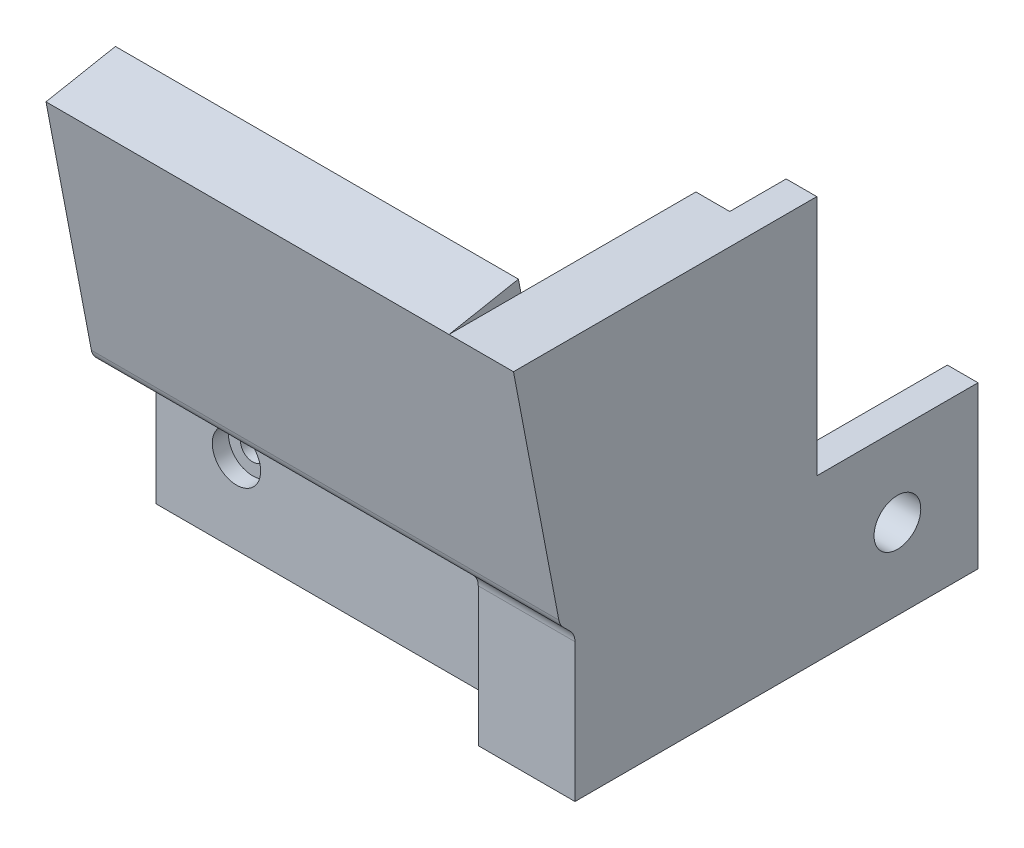
ISO-10303-21;
HEADER;
FILE_DESCRIPTION(('STEP AP214'),'2;1');
FILE_NAME('part.step','',(''),(''),'','','');
FILE_SCHEMA(('AUTOMOTIVE_DESIGN { 1 0 10303 214 1 1 1 1 }'));
ENDSEC;
DATA;
#1=APPLICATION_CONTEXT('core data for automotive mechanical design processes');
#2=APPLICATION_PROTOCOL_DEFINITION('international standard','automotive_design',2000,#1);
#3=PRODUCT_CONTEXT('',#1,'mechanical');
#4=PRODUCT('Part','Part','',(#3));
#5=PRODUCT_RELATED_PRODUCT_CATEGORY('part','',(#4));
#6=PRODUCT_DEFINITION_FORMATION('','',#4);
#7=PRODUCT_DEFINITION_CONTEXT('part definition',#1,'design');
#8=PRODUCT_DEFINITION('design','',#6,#7);
#9=PRODUCT_DEFINITION_SHAPE('','',#8);
#10=(LENGTH_UNIT() NAMED_UNIT(*) SI_UNIT(.MILLI.,.METRE.));
#11=(NAMED_UNIT(*) PLANE_ANGLE_UNIT() SI_UNIT($,.RADIAN.));
#12=(NAMED_UNIT(*) SI_UNIT($,.STERADIAN.) SOLID_ANGLE_UNIT());
#13=UNCERTAINTY_MEASURE_WITH_UNIT(LENGTH_MEASURE(1.E-05),#10,'distance_accuracy_value','');
#14=(GEOMETRIC_REPRESENTATION_CONTEXT(3) GLOBAL_UNCERTAINTY_ASSIGNED_CONTEXT((#13)) GLOBAL_UNIT_ASSIGNED_CONTEXT((#10,
#11,#12)) REPRESENTATION_CONTEXT('',''));
#15=CARTESIAN_POINT('',(0.,0.,0.));
#16=DIRECTION('',(0.,0.,1.));
#17=DIRECTION('',(1.,0.,0.));
#18=AXIS2_PLACEMENT_3D('',#15,#16,#17);
#19=CARTESIAN_POINT('',(50.,41.4553683976997,10.));
#20=DIRECTION('',(0.,-0.187368284578925,0.982289736245855));
#21=DIRECTION('',(0.,-0.982289736245855,-0.187368284578925));
#22=AXIS2_PLACEMENT_3D('',#19,#20,#21);
#23=PLANE('',#22);
#24=DIRECTION('',(-1.,0.,0.));
#25=VECTOR('',#24,1.);
#26=CARTESIAN_POINT('',(0.,25.7276841988498,7.));
#27=LINE('',#26,#25);
#28=CARTESIAN_POINT('',(50.,25.7276841988498,7.));
#29=VERTEX_POINT('',#28);
#30=CARTESIAN_POINT('',(0.,25.7276841988498,7.));
#31=VERTEX_POINT('',#30);
#32=EDGE_CURVE('E64',#29,#31,#27,.T.);
#33=ORIENTED_EDGE('',*,*,#32,.F.);
#34=DIRECTION('',(0.,0.982289736245855,0.187368284578925));
#35=VECTOR('',#34,1.);
#36=CARTESIAN_POINT('',(50.,41.4553683976997,10.));
#37=LINE('',#36,#35);
#38=CARTESIAN_POINT('',(50.,10.,4.));
#39=VERTEX_POINT('',#38);
#40=EDGE_CURVE('E366',#39,#29,#37,.T.);
#41=ORIENTED_EDGE('',*,*,#40,.F.);
#42=DIRECTION('',(-1.,0.,0.));
#43=VECTOR('',#42,1.);
#44=CARTESIAN_POINT('',(50.,10.,4.));
#45=LINE('',#44,#43);
#46=CARTESIAN_POINT('',(0.,9.99999999999995,4.));
#47=VERTEX_POINT('',#46);
#48=EDGE_CURVE('E373',#39,#47,#45,.T.);
#49=ORIENTED_EDGE('',*,*,#48,.T.);
#50=DIRECTION('',(0.,0.982289736245855,0.187368284578925));
#51=VECTOR('',#50,1.);
#52=CARTESIAN_POINT('',(0.,41.4553683976997,10.));
#53=LINE('',#52,#51);
#54=EDGE_CURVE('E209',#47,#31,#53,.T.);
#55=ORIENTED_EDGE('',*,*,#54,.T.);
#56=EDGE_LOOP('',(#33,#41,#49,#55));
#57=FACE_BOUND('',#56,.T.);
#58=ADVANCED_FACE('F39',(#57),#23,.F.);
#59=CARTESIAN_POINT('',(50.,40.,57.851648071345));
#60=DIRECTION('',(-1.,0.,0.));
#61=DIRECTION('',(0.,0.,1.));
#62=AXIS2_PLACEMENT_3D('',#59,#60,#61);
#63=PLANE('',#62);
#64=CARTESIAN_POINT('',(50.,0.,-30.));
#65=DIRECTION('',(-1.,0.,0.));
#66=DIRECTION('',(0.,0.,1.));
#67=AXIS2_PLACEMENT_3D('',#64,#65,#66);
#68=CIRCLE('',#67,1.5);
#69=CARTESIAN_POINT('',(50.,0.,-28.5));
#70=VERTEX_POINT('',#69);
#71=EDGE_CURVE('E247',#70,#70,#68,.T.);
#72=ORIENTED_EDGE('',*,*,#71,.F.);
#73=EDGE_LOOP('',(#72));
#74=FACE_BOUND('',#73,.T.);
#75=ORIENTED_EDGE('',*,*,#40,.T.);
#76=DIRECTION('',(0.,-0.187368284578925,0.982289736245855));
#77=VECTOR('',#76,1.);
#78=CARTESIAN_POINT('',(50.,25.9150524834288,6.01771026375414));
#79=LINE('',#78,#77);
#80=CARTESIAN_POINT('',(50.,25.9150524834288,6.01771026375414));
#81=VERTEX_POINT('',#80);
#82=EDGE_CURVE('E56',#81,#29,#79,.T.);
#83=ORIENTED_EDGE('',*,*,#82,.F.);
#84=DIRECTION('',(0.,-0.982289736245855,-0.187368284578925));
#85=VECTOR('',#84,1.);
#86=CARTESIAN_POINT('',(50.,25.9150524834288,6.01771026375414));
#87=LINE('',#86,#85);
#88=CARTESIAN_POINT('',(50.,40.,8.70436406576803));
#89=VERTEX_POINT('',#88);
#90=EDGE_CURVE('E219',#89,#81,#87,.T.);
#91=ORIENTED_EDGE('',*,*,#90,.F.);
#92=DIRECTION('',(0.,0.,-1.));
#93=VECTOR('',#92,1.);
#94=CARTESIAN_POINT('',(50.,40.,57.851648071345));
#95=LINE('',#94,#93);
#96=CARTESIAN_POINT('',(50.,40.,-13.));
#97=VERTEX_POINT('',#96);
#98=EDGE_CURVE('E333',#89,#97,#95,.T.);
#99=ORIENTED_EDGE('',*,*,#98,.T.);
#100=DIRECTION('',(0.,1.,0.));
#101=VECTOR('',#100,1.);
#102=CARTESIAN_POINT('',(50.,40.,-13.));
#103=LINE('',#102,#101);
#104=CARTESIAN_POINT('',(50.,2.99999999999999,-13.));
#105=VERTEX_POINT('',#104);
#106=EDGE_CURVE('E254',#105,#97,#103,.T.);
#107=ORIENTED_EDGE('',*,*,#106,.F.);
#108=DIRECTION('',(0.,0.,1.));
#109=VECTOR('',#108,1.);
#110=CARTESIAN_POINT('',(50.,2.99999999999999,-13.));
#111=LINE('',#110,#109);
#112=CARTESIAN_POINT('',(50.,2.99999999999999,-40.));
#113=VERTEX_POINT('',#112);
#114=EDGE_CURVE('E250',#113,#105,#111,.T.);
#115=ORIENTED_EDGE('',*,*,#114,.F.);
#116=DIRECTION('',(0.,1.,0.));
#117=VECTOR('',#116,1.);
#118=CARTESIAN_POINT('',(50.,-10.,-40.));
#119=LINE('',#118,#117);
#120=CARTESIAN_POINT('',(50.,-10.,-40.));
#121=VERTEX_POINT('',#120);
#122=EDGE_CURVE('E279',#121,#113,#119,.T.);
#123=ORIENTED_EDGE('',*,*,#122,.F.);
#124=DIRECTION('',(0.,0.,-1.));
#125=VECTOR('',#124,1.);
#126=CARTESIAN_POINT('',(50.,-10.,0.));
#127=LINE('',#126,#125);
#128=CARTESIAN_POINT('',(50.,-10.,0.));
#129=VERTEX_POINT('',#128);
#130=EDGE_CURVE('E295',#129,#121,#127,.T.);
#131=ORIENTED_EDGE('',*,*,#130,.F.);
#132=DIRECTION('',(0.,1.,0.));
#133=VECTOR('',#132,1.);
#134=CARTESIAN_POINT('',(50.,-31.540659228538,0.));
#135=LINE('',#134,#133);
#136=CARTESIAN_POINT('',(50.,9.99999999999999,0.));
#137=VERTEX_POINT('',#136);
#138=EDGE_CURVE('E294',#129,#137,#135,.T.);
#139=ORIENTED_EDGE('',*,*,#138,.T.);
#140=DIRECTION('',(0.,0.,1.));
#141=VECTOR('',#140,1.);
#142=CARTESIAN_POINT('',(50.,10.,0.));
#143=LINE('',#142,#141);
#144=EDGE_CURVE('E321',#137,#39,#143,.T.);
#145=ORIENTED_EDGE('',*,*,#144,.T.);
#146=EDGE_LOOP('',(#75,#83,#91,#99,#107,#115,#123,#131,#139,#145));
#147=FACE_BOUND('',#146,.T.);
#148=ADVANCED_FACE('F417',(#74,#147),#63,.T.);
#149=CARTESIAN_POINT('',(9.99999999999999,0.,0.));
#150=DIRECTION('',(0.,0.,1.));
#151=DIRECTION('',(1.,0.,0.));
#152=AXIS2_PLACEMENT_3D('',#149,#150,#151);
#153=CYLINDRICAL_SURFACE('',#152,1.5);
#154=CARTESIAN_POINT('',(9.99999999999999,0.,0.));
#155=DIRECTION('',(0.,0.,1.));
#156=DIRECTION('',(1.,0.,0.));
#157=AXIS2_PLACEMENT_3D('',#154,#155,#156);
#158=CIRCLE('',#157,1.5);
#159=CARTESIAN_POINT('',(11.5,0.,0.));
#160=VERTEX_POINT('',#159);
#161=EDGE_CURVE('E357',#160,#160,#158,.T.);
#162=ORIENTED_EDGE('',*,*,#161,.F.);
#163=EDGE_LOOP('',(#162));
#164=FACE_BOUND('',#163,.T.);
#165=CARTESIAN_POINT('',(9.99999999999999,0.,2.));
#166=DIRECTION('',(0.,0.,1.));
#167=DIRECTION('',(1.,0.,0.));
#168=AXIS2_PLACEMENT_3D('',#165,#166,#167);
#169=CIRCLE('',#168,1.5);
#170=CARTESIAN_POINT('',(11.5,0.,2.));
#171=VERTEX_POINT('',#170);
#172=EDGE_CURVE('E43',#171,#171,#169,.F.);
#173=ORIENTED_EDGE('',*,*,#172,.F.);
#174=EDGE_LOOP('',(#173));
#175=FACE_BOUND('',#174,.T.);
#176=ADVANCED_FACE('F422',(#164,#175),#153,.F.);
#177=CARTESIAN_POINT('',(0.,0.,-20.));
#178=DIRECTION('',(0.,0.,1.));
#179=DIRECTION('',(1.,0.,0.));
#180=AXIS2_PLACEMENT_3D('',#177,#178,#179);
#181=PLANE('',#180);
#182=DIRECTION('',(1.,0.,0.));
#183=VECTOR('',#182,1.);
#184=CARTESIAN_POINT('',(50.,9.99999999999999,-20.));
#185=LINE('',#184,#183);
#186=CARTESIAN_POINT('',(54.2,9.99999999999999,-20.));
#187=VERTEX_POINT('',#186);
#188=CARTESIAN_POINT('',(58.,9.99999999999999,-20.));
#189=VERTEX_POINT('',#188);
#190=EDGE_CURVE('E275',#187,#189,#185,.T.);
#191=ORIENTED_EDGE('',*,*,#190,.F.);
#192=DIRECTION('',(0.,-1.,0.));
#193=VECTOR('',#192,1.);
#194=CARTESIAN_POINT('',(54.2,9.99999999999999,-20.));
#195=LINE('',#194,#193);
#196=CARTESIAN_POINT('',(54.2,40.,-20.));
#197=VERTEX_POINT('',#196);
#198=EDGE_CURVE('E251',#197,#187,#195,.T.);
#199=ORIENTED_EDGE('',*,*,#198,.F.);
#200=DIRECTION('',(1.,0.,0.));
#201=VECTOR('',#200,1.);
#202=CARTESIAN_POINT('',(50.,40.,-20.));
#203=LINE('',#202,#201);
#204=CARTESIAN_POINT('',(58.,40.,-20.));
#205=VERTEX_POINT('',#204);
#206=EDGE_CURVE('E331',#197,#205,#203,.T.);
#207=ORIENTED_EDGE('',*,*,#206,.T.);
#208=DIRECTION('',(0.,1.,0.));
#209=VECTOR('',#208,1.);
#210=CARTESIAN_POINT('',(58.,12.,-20.));
#211=LINE('',#210,#209);
#212=EDGE_CURVE('E306',#189,#205,#211,.T.);
#213=ORIENTED_EDGE('',*,*,#212,.F.);
#214=EDGE_LOOP('',(#191,#199,#207,#213));
#215=FACE_BOUND('',#214,.T.);
#216=ADVANCED_FACE('F437',(#215),#181,.F.);
#217=CARTESIAN_POINT('',(50.,10.,0.));
#218=DIRECTION('',(0.,0.,1.));
#219=DIRECTION('',(1.,0.,0.));
#220=AXIS2_PLACEMENT_3D('',#217,#218,#219);
#221=PLANE('',#220);
#222=ORIENTED_EDGE('',*,*,#161,.T.);
#223=EDGE_LOOP('',(#222));
#224=FACE_BOUND('',#223,.T.);
#225=ORIENTED_EDGE('',*,*,#138,.F.);
#226=DIRECTION('',(1.,0.,0.));
#227=VECTOR('',#226,1.);
#228=CARTESIAN_POINT('',(0.,-10.,0.));
#229=LINE('',#228,#227);
#230=CARTESIAN_POINT('',(0.,-10.,0.));
#231=VERTEX_POINT('',#230);
#232=EDGE_CURVE('E363',#231,#129,#229,.T.);
#233=ORIENTED_EDGE('',*,*,#232,.F.);
#234=DIRECTION('',(0.,1.,0.));
#235=VECTOR('',#234,1.);
#236=CARTESIAN_POINT('',(0.,10.,0.));
#237=LINE('',#236,#235);
#238=CARTESIAN_POINT('',(0.,10.,0.));
#239=VERTEX_POINT('',#238);
#240=EDGE_CURVE('E12',#231,#239,#237,.T.);
#241=ORIENTED_EDGE('',*,*,#240,.T.);
#242=DIRECTION('',(-1.,0.,0.));
#243=VECTOR('',#242,1.);
#244=CARTESIAN_POINT('',(50.,10.,0.));
#245=LINE('',#244,#243);
#246=EDGE_CURVE('E375',#137,#239,#245,.T.);
#247=ORIENTED_EDGE('',*,*,#246,.F.);
#248=EDGE_LOOP('',(#225,#233,#241,#247));
#249=FACE_BOUND('',#248,.T.);
#250=ADVANCED_FACE('F433',(#224,#249),#221,.F.);
#251=CARTESIAN_POINT('',(50.,0.,0.));
#252=DIRECTION('',(-1.,0.,0.));
#253=DIRECTION('',(0.,0.,1.));
#254=AXIS2_PLACEMENT_3D('',#251,#252,#253);
#255=PLANE('',#254);
#256=DIRECTION('',(0.,-0.187368284578925,0.982289736245855));
#257=VECTOR('',#256,1.);
#258=CARTESIAN_POINT('',(50.,40.,17.6298581840024));
#259=LINE('',#258,#257);
#260=CARTESIAN_POINT('',(50.,41.6427366822786,9.01771026375415));
#261=VERTEX_POINT('',#260);
#262=CARTESIAN_POINT('',(50.,40.,17.6298581840024));
#263=VERTEX_POINT('',#262);
#264=EDGE_CURVE('E215',#261,#263,#259,.T.);
#265=ORIENTED_EDGE('',*,*,#264,.T.);
#266=EDGE_CURVE('E334',#263,#89,#95,.T.);
#267=ORIENTED_EDGE('',*,*,#266,.T.);
#268=EDGE_CURVE('E228',#261,#89,#87,.T.);
#269=ORIENTED_EDGE('',*,*,#268,.F.);
#270=EDGE_LOOP('',(#265,#267,#269));
#271=FACE_BOUND('',#270,.T.);
#272=ADVANCED_FACE('F436',(#271),#255,.F.);
#273=CARTESIAN_POINT('',(0.,0.,4.));
#274=DIRECTION('',(0.,0.,1.));
#275=DIRECTION('',(1.,0.,0.));
#276=AXIS2_PLACEMENT_3D('',#273,#274,#275);
#277=PLANE('',#276);
#278=CARTESIAN_POINT('',(9.99999999999999,0.,4.));
#279=DIRECTION('',(0.,0.,1.));
#280=DIRECTION('',(1.,0.,0.));
#281=AXIS2_PLACEMENT_3D('',#278,#279,#280);
#282=CIRCLE('',#281,3.);
#283=CARTESIAN_POINT('',(13.,0.,4.));
#284=VERTEX_POINT('',#283);
#285=EDGE_CURVE('E234',#284,#284,#282,.T.);
#286=ORIENTED_EDGE('',*,*,#285,.F.);
#287=EDGE_LOOP('',(#286));
#288=FACE_BOUND('',#287,.T.);
#289=DIRECTION('',(1.,0.,0.));
#290=VECTOR('',#289,1.);
#291=CARTESIAN_POINT('',(-20.,-10.,4.));
#292=LINE('',#291,#290);
#293=CARTESIAN_POINT('',(0.,-10.,4.));
#294=VERTEX_POINT('',#293);
#295=CARTESIAN_POINT('',(46.,-10.,4.));
#296=VERTEX_POINT('',#295);
#297=EDGE_CURVE('E353',#294,#296,#292,.T.);
#298=ORIENTED_EDGE('',*,*,#297,.T.);
#299=DIRECTION('',(0.,1.,0.));
#300=VECTOR('',#299,1.);
#301=CARTESIAN_POINT('',(46.,-17.211102550928,4.));
#302=LINE('',#301,#300);
#303=CARTESIAN_POINT('',(46.,8.00398027565438,4.));
#304=VERTEX_POINT('',#303);
#305=EDGE_CURVE('E341',#296,#304,#302,.T.);
#306=ORIENTED_EDGE('',*,*,#305,.T.);
#307=DIRECTION('',(-1.,0.,0.));
#308=VECTOR('',#307,1.);
#309=CARTESIAN_POINT('',(50.,8.00398027565438,4.));
#310=LINE('',#309,#308);
#311=CARTESIAN_POINT('',(0.,8.00398027565438,4.));
#312=VERTEX_POINT('',#311);
#313=EDGE_CURVE('E355',#304,#312,#310,.T.);
#314=ORIENTED_EDGE('',*,*,#313,.T.);
#315=DIRECTION('',(0.,1.,0.));
#316=VECTOR('',#315,1.);
#317=CARTESIAN_POINT('',(0.,-10.,4.));
#318=LINE('',#317,#316);
#319=EDGE_CURVE('E324',#294,#312,#318,.T.);
#320=ORIENTED_EDGE('',*,*,#319,.F.);
#321=EDGE_LOOP('',(#298,#306,#314,#320));
#322=FACE_BOUND('',#321,.T.);
#323=ADVANCED_FACE('F488',(#288,#322),#277,.T.);
#324=CARTESIAN_POINT('',(50.,8.00398027565438,4.));
#325=DIRECTION('',(0.,1.,0.));
#326=DIRECTION('',(0.,0.,1.));
#327=AXIS2_PLACEMENT_3D('',#324,#325,#326);
#328=PLANE('',#327);
#329=DIRECTION('',(0.,0.,-1.));
#330=VECTOR('',#329,1.);
#331=CARTESIAN_POINT('',(46.,8.00398027565438,10.));
#332=LINE('',#331,#330);
#333=CARTESIAN_POINT('',(46.,8.00398027565438,10.));
#334=VERTEX_POINT('',#333);
#335=EDGE_CURVE('E338',#334,#304,#332,.T.);
#336=ORIENTED_EDGE('',*,*,#335,.F.);
#337=DIRECTION('',(-1.,0.,0.));
#338=VECTOR('',#337,1.);
#339=CARTESIAN_POINT('',(0.,8.00398027565438,10.));
#340=LINE('',#339,#338);
#341=CARTESIAN_POINT('',(0.,8.00398027565438,10.));
#342=VERTEX_POINT('',#341);
#343=EDGE_CURVE('E377',#334,#342,#340,.T.);
#344=ORIENTED_EDGE('',*,*,#343,.T.);
#345=DIRECTION('',(0.,0.,1.));
#346=VECTOR('',#345,1.);
#347=CARTESIAN_POINT('',(0.,8.00398027565438,4.));
#348=LINE('',#347,#346);
#349=EDGE_CURVE('E325',#312,#342,#348,.T.);
#350=ORIENTED_EDGE('',*,*,#349,.F.);
#351=ORIENTED_EDGE('',*,*,#313,.F.);
#352=EDGE_LOOP('',(#336,#344,#350,#351));
#353=FACE_BOUND('',#352,.T.);
#354=ADVANCED_FACE('F493',(#353),#328,.F.);
#355=CARTESIAN_POINT('',(0.,-10.,0.));
#356=DIRECTION('',(0.,-1.,0.));
#357=DIRECTION('',(0.,0.,-1.));
#358=AXIS2_PLACEMENT_3D('',#355,#356,#357);
#359=PLANE('',#358);
#360=ORIENTED_EDGE('',*,*,#297,.F.);
#361=DIRECTION('',(0.,0.,-1.));
#362=VECTOR('',#361,1.);
#363=CARTESIAN_POINT('',(0.,-10.,10.));
#364=LINE('',#363,#362);
#365=EDGE_CURVE('E345',#294,#231,#364,.T.);
#366=ORIENTED_EDGE('',*,*,#365,.T.);
#367=ORIENTED_EDGE('',*,*,#232,.T.);
#368=ORIENTED_EDGE('',*,*,#130,.T.);
#369=DIRECTION('',(-1.,0.,0.));
#370=VECTOR('',#369,1.);
#371=CARTESIAN_POINT('',(50.,-10.,-40.));
#372=LINE('',#371,#370);
#373=CARTESIAN_POINT('',(58.,-10.,-40.));
#374=VERTEX_POINT('',#373);
#375=EDGE_CURVE('E287',#374,#121,#372,.T.);
#376=ORIENTED_EDGE('',*,*,#375,.F.);
#377=DIRECTION('',(0.,0.,-1.));
#378=VECTOR('',#377,1.);
#379=CARTESIAN_POINT('',(58.,-10.,10.));
#380=LINE('',#379,#378);
#381=CARTESIAN_POINT('',(58.,-10.,10.));
#382=VERTEX_POINT('',#381);
#383=EDGE_CURVE('E304',#382,#374,#380,.T.);
#384=ORIENTED_EDGE('',*,*,#383,.F.);
#385=DIRECTION('',(-1.,0.,0.));
#386=VECTOR('',#385,1.);
#387=CARTESIAN_POINT('',(50.,-10.,10.));
#388=LINE('',#387,#386);
#389=CARTESIAN_POINT('',(46.,-10.,10.));
#390=VERTEX_POINT('',#389);
#391=EDGE_CURVE('E346',#382,#390,#388,.T.);
#392=ORIENTED_EDGE('',*,*,#391,.T.);
#393=DIRECTION('',(0.,0.,-1.));
#394=VECTOR('',#393,1.);
#395=CARTESIAN_POINT('',(46.,-10.,10.));
#396=LINE('',#395,#394);
#397=EDGE_CURVE('E342',#390,#296,#396,.T.);
#398=ORIENTED_EDGE('',*,*,#397,.T.);
#399=EDGE_LOOP('',(#360,#366,#367,#368,#376,#384,#392,#398));
#400=FACE_BOUND('',#399,.T.);
#401=ADVANCED_FACE('F431',(#400),#359,.T.);
#402=CARTESIAN_POINT('',(50.,10.,4.));
#403=DIRECTION('',(0.,-1.,0.));
#404=DIRECTION('',(0.,0.,-1.));
#405=AXIS2_PLACEMENT_3D('',#402,#403,#404);
#406=PLANE('',#405);
#407=ORIENTED_EDGE('',*,*,#48,.F.);
#408=ORIENTED_EDGE('',*,*,#144,.F.);
#409=ORIENTED_EDGE('',*,*,#246,.T.);
#410=DIRECTION('',(0.,0.,-1.));
#411=VECTOR('',#410,1.);
#412=CARTESIAN_POINT('',(0.,10.,0.));
#413=LINE('',#412,#411);
#414=EDGE_CURVE('E360',#47,#239,#413,.T.);
#415=ORIENTED_EDGE('',*,*,#414,.F.);
#416=EDGE_LOOP('',(#407,#408,#409,#415));
#417=FACE_BOUND('',#416,.T.);
#418=ADVANCED_FACE('F428',(#417),#406,.F.);
#419=CARTESIAN_POINT('',(0.,0.,0.));
#420=DIRECTION('',(-1.,0.,0.));
#421=DIRECTION('',(0.,0.,1.));
#422=AXIS2_PLACEMENT_3D('',#419,#420,#421);
#423=PLANE('',#422);
#424=ORIENTED_EDGE('',*,*,#319,.T.);
#425=ORIENTED_EDGE('',*,*,#349,.T.);
#426=DIRECTION('',(0.,-0.707106781186544,-0.707106781186552));
#427=VECTOR('',#426,1.);
#428=CARTESIAN_POINT('',(0.,10.0039802756544,12.));
#429=LINE('',#428,#427);
#430=CARTESIAN_POINT('',(0.,9.45549260812723,11.4515123324729));
#431=VERTEX_POINT('',#430);
#432=EDGE_CURVE('E379',#342,#431,#429,.F.);
#433=ORIENTED_EDGE('',*,*,#432,.T.);
#434=CARTESIAN_POINT('',(0.,10.8697061705003,10.0372987700998));
#435=DIRECTION('',(-1.,0.,0.));
#436=DIRECTION('',(0.,0.,1.));
#437=AXIS2_PLACEMENT_3D('',#434,#435,#436);
#438=CIRCLE('',#437,2.);
#439=CARTESIAN_POINT('',(0.,10.4949696013425,12.0018782425915));
#440=VERTEX_POINT('',#439);
#441=EDGE_CURVE('E391',#431,#440,#438,.T.);
#442=ORIENTED_EDGE('',*,*,#441,.T.);
#443=DIRECTION('',(0.,-0.982289736245855,-0.187368284578925));
#444=VECTOR('',#443,1.);
#445=CARTESIAN_POINT('',(0.,0.,10.));
#446=LINE('',#445,#444);
#447=CARTESIAN_POINT('',(0.,40.,17.6298581840024));
#448=VERTEX_POINT('',#447);
#449=EDGE_CURVE('E205',#448,#440,#446,.T.);
#450=ORIENTED_EDGE('',*,*,#449,.F.);
#451=DIRECTION('',(0.,-0.187368284578925,0.982289736245855));
#452=VECTOR('',#451,1.);
#453=CARTESIAN_POINT('',(0.,40.,17.6298581840024));
#454=LINE('',#453,#452);
#455=CARTESIAN_POINT('',(0.,41.6427366822786,9.01771026375415));
#456=VERTEX_POINT('',#455);
#457=EDGE_CURVE('E197',#456,#448,#454,.T.);
#458=ORIENTED_EDGE('',*,*,#457,.F.);
#459=DIRECTION('',(0.,0.982289736245855,0.187368284578925));
#460=VECTOR('',#459,1.);
#461=CARTESIAN_POINT('',(0.,25.9150524834288,6.01771026375414));
#462=LINE('',#461,#460);
#463=CARTESIAN_POINT('',(0.,25.9150524834288,6.01771026375414));
#464=VERTEX_POINT('',#463);
#465=EDGE_CURVE('E203',#464,#456,#462,.T.);
#466=ORIENTED_EDGE('',*,*,#465,.F.);
#467=DIRECTION('',(0.,-0.187368284578925,0.982289736245855));
#468=VECTOR('',#467,1.);
#469=CARTESIAN_POINT('',(0.,25.9150524834288,6.01771026375414));
#470=LINE('',#469,#468);
#471=EDGE_CURVE('E230',#464,#31,#470,.T.);
#472=ORIENTED_EDGE('',*,*,#471,.T.);
#473=ORIENTED_EDGE('',*,*,#54,.F.);
#474=ORIENTED_EDGE('',*,*,#414,.T.);
#475=ORIENTED_EDGE('',*,*,#240,.F.);
#476=ORIENTED_EDGE('',*,*,#365,.F.);
#477=EDGE_LOOP('',(#424,#425,#433,#442,#450,#458,#466,#472,#473,#474,#475,#476));
#478=FACE_BOUND('',#477,.T.);
#479=ADVANCED_FACE('F200',(#478),#423,.T.);
#480=CARTESIAN_POINT('',(50.,40.,17.6298581840024));
#481=DIRECTION('',(0.,-0.982289736245855,-0.187368284578925));
#482=DIRECTION('',(0.,0.187368284578925,-0.982289736245855));
#483=AXIS2_PLACEMENT_3D('',#480,#481,#482);
#484=PLANE('',#483);
#485=ORIENTED_EDGE('',*,*,#457,.T.);
#486=DIRECTION('',(-1.,0.,0.));
#487=VECTOR('',#486,1.);
#488=CARTESIAN_POINT('',(50.,40.,17.6298581840024));
#489=LINE('',#488,#487);
#490=EDGE_CURVE('E369',#263,#448,#489,.T.);
#491=ORIENTED_EDGE('',*,*,#490,.F.);
#492=ORIENTED_EDGE('',*,*,#264,.F.);
#493=DIRECTION('',(1.,0.,0.));
#494=VECTOR('',#493,1.);
#495=CARTESIAN_POINT('',(0.,41.6427366822786,9.01771026375415));
#496=LINE('',#495,#494);
#497=EDGE_CURVE('E212',#456,#261,#496,.T.);
#498=ORIENTED_EDGE('',*,*,#497,.F.);
#499=EDGE_LOOP('',(#485,#491,#492,#498));
#500=FACE_BOUND('',#499,.T.);
#501=ADVANCED_FACE('F213',(#500),#484,.F.);
#502=CARTESIAN_POINT('',(50.,0.,10.));
#503=DIRECTION('',(0.,0.187368284578925,-0.982289736245855));
#504=DIRECTION('',(0.,0.982289736245855,0.187368284578925));
#505=AXIS2_PLACEMENT_3D('',#502,#503,#504);
#506=PLANE('',#505);
#507=DIRECTION('',(-1.,0.,0.));
#508=VECTOR('',#507,1.);
#509=CARTESIAN_POINT('',(50.,10.4949696013425,12.0018782425915));
#510=LINE('',#509,#508);
#511=CARTESIAN_POINT('',(58.,10.4949696013425,12.0018782425915));
#512=VERTEX_POINT('',#511);
#513=EDGE_CURVE('E382',#440,#512,#510,.F.);
#514=ORIENTED_EDGE('',*,*,#513,.T.);
#515=DIRECTION('',(0.,-0.982289736245855,-0.187368284578925));
#516=VECTOR('',#515,1.);
#517=CARTESIAN_POINT('',(58.,40.,17.6298581840024));
#518=LINE('',#517,#516);
#519=CARTESIAN_POINT('',(58.,40.,17.6298581840024));
#520=VERTEX_POINT('',#519);
#521=EDGE_CURVE('E312',#520,#512,#518,.T.);
#522=ORIENTED_EDGE('',*,*,#521,.F.);
#523=DIRECTION('',(1.,0.,0.));
#524=VECTOR('',#523,1.);
#525=CARTESIAN_POINT('',(54.,40.,17.6298581840024));
#526=LINE('',#525,#524);
#527=EDGE_CURVE('E328',#263,#520,#526,.T.);
#528=ORIENTED_EDGE('',*,*,#527,.F.);
#529=ORIENTED_EDGE('',*,*,#490,.T.);
#530=ORIENTED_EDGE('',*,*,#449,.T.);
#531=EDGE_LOOP('',(#514,#522,#528,#529,#530));
#532=FACE_BOUND('',#531,.T.);
#533=ADVANCED_FACE('F445',(#532),#506,.F.);
#534=CARTESIAN_POINT('',(-10.1843477606596,10.0039802756544,12.));
#535=DIRECTION('',(0.,-0.707106781186551,0.707106781186543));
#536=DIRECTION('',(-1.,0.,0.));
#537=AXIS2_PLACEMENT_3D('',#534,#535,#536);
#538=PLANE('',#537);
#539=ORIENTED_EDGE('',*,*,#432,.F.);
#540=ORIENTED_EDGE('',*,*,#343,.F.);
#541=DIRECTION('',(0.,-0.707106781186544,-0.707106781186552));
#542=VECTOR('',#541,1.);
#543=CARTESIAN_POINT('',(46.,-4.60356113763666,-2.60754141329118));
#544=LINE('',#543,#542);
#545=CARTESIAN_POINT('',(46.,8.58976671328129,10.5857864376269));
#546=VERTEX_POINT('',#545);
#547=EDGE_CURVE('E386',#334,#546,#544,.F.);
#548=ORIENTED_EDGE('',*,*,#547,.T.);
#549=DIRECTION('',(-1.,0.,0.));
#550=VECTOR('',#549,1.);
#551=CARTESIAN_POINT('',(50.,8.58976671328129,10.5857864376269));
#552=LINE('',#551,#550);
#553=CARTESIAN_POINT('',(58.,8.5897667132813,10.5857864376269));
#554=VERTEX_POINT('',#553);
#555=EDGE_CURVE('E384',#546,#554,#552,.F.);
#556=ORIENTED_EDGE('',*,*,#555,.T.);
#557=DIRECTION('',(0.,-0.707106781186543,-0.707106781186552));
#558=VECTOR('',#557,1.);
#559=CARTESIAN_POINT('',(58.,9.45549260812723,11.4515123324729));
#560=LINE('',#559,#558);
#561=CARTESIAN_POINT('',(58.,9.45549260812723,11.4515123324729));
#562=VERTEX_POINT('',#561);
#563=EDGE_CURVE('E318',#562,#554,#560,.T.);
#564=ORIENTED_EDGE('',*,*,#563,.F.);
#565=DIRECTION('',(1.,0.,0.));
#566=VECTOR('',#565,1.);
#567=CARTESIAN_POINT('',(-10.1843477606596,9.45549260812723,11.4515123324729));
#568=LINE('',#567,#566);
#569=EDGE_CURVE('E389',#562,#431,#568,.F.);
#570=ORIENTED_EDGE('',*,*,#569,.T.);
#571=EDGE_LOOP('',(#539,#540,#548,#556,#564,#570));
#572=FACE_BOUND('',#571,.T.);
#573=ADVANCED_FACE('F440',(#572),#538,.T.);
#574=CARTESIAN_POINT('',(50.,-17.211102550928,10.));
#575=DIRECTION('',(0.,0.,-1.));
#576=DIRECTION('',(-1.,0.,0.));
#577=AXIS2_PLACEMENT_3D('',#574,#575,#576);
#578=PLANE('',#577);
#579=ORIENTED_EDGE('',*,*,#391,.F.);
#580=DIRECTION('',(0.,-1.,0.));
#581=VECTOR('',#580,1.);
#582=CARTESIAN_POINT('',(58.,7.1755531509082,10.));
#583=LINE('',#582,#581);
#584=CARTESIAN_POINT('',(58.,7.1755531509082,10.));
#585=VERTEX_POINT('',#584);
#586=EDGE_CURVE('E301',#585,#382,#583,.T.);
#587=ORIENTED_EDGE('',*,*,#586,.F.);
#588=DIRECTION('',(1.,0.,0.));
#589=VECTOR('',#588,1.);
#590=CARTESIAN_POINT('',(46.,7.17555315090819,10.));
#591=LINE('',#590,#589);
#592=CARTESIAN_POINT('',(46.,7.17555315090819,10.));
#593=VERTEX_POINT('',#592);
#594=EDGE_CURVE('E393',#585,#593,#591,.F.);
#595=ORIENTED_EDGE('',*,*,#594,.T.);
#596=DIRECTION('',(0.,1.,0.));
#597=VECTOR('',#596,1.);
#598=CARTESIAN_POINT('',(46.,-17.211102550928,10.));
#599=LINE('',#598,#597);
#600=EDGE_CURVE('E337',#390,#593,#599,.T.);
#601=ORIENTED_EDGE('',*,*,#600,.F.);
#602=EDGE_LOOP('',(#579,#587,#595,#601));
#603=FACE_BOUND('',#602,.T.);
#604=ADVANCED_FACE('F444',(#603),#578,.F.);
#605=CARTESIAN_POINT('',(46.,-17.211102550928,10.));
#606=DIRECTION('',(1.,0.,0.));
#607=DIRECTION('',(0.,0.,-1.));
#608=AXIS2_PLACEMENT_3D('',#605,#606,#607);
#609=PLANE('',#608);
#610=ORIENTED_EDGE('',*,*,#397,.F.);
#611=ORIENTED_EDGE('',*,*,#600,.T.);
#612=CARTESIAN_POINT('',(46.,7.17555315090819,12.));
#613=DIRECTION('',(1.,0.,0.));
#614=DIRECTION('',(0.,0.,-1.));
#615=AXIS2_PLACEMENT_3D('',#612,#613,#614);
#616=CIRCLE('',#615,2.);
#617=EDGE_CURVE('E48',#593,#546,#616,.T.);
#618=ORIENTED_EDGE('',*,*,#617,.T.);
#619=ORIENTED_EDGE('',*,*,#547,.F.);
#620=ORIENTED_EDGE('',*,*,#335,.T.);
#621=ORIENTED_EDGE('',*,*,#305,.F.);
#622=EDGE_LOOP('',(#610,#611,#618,#619,#620,#621));
#623=FACE_BOUND('',#622,.T.);
#624=ADVANCED_FACE('F449',(#623),#609,.F.);
#625=CARTESIAN_POINT('',(50.,10.8697061705003,10.0372987700998));
#626=DIRECTION('',(-1.,0.,0.));
#627=DIRECTION('',(0.,0.,1.));
#628=AXIS2_PLACEMENT_3D('',#625,#626,#627);
#629=CYLINDRICAL_SURFACE('',#628,2.);
#630=ORIENTED_EDGE('',*,*,#441,.F.);
#631=ORIENTED_EDGE('',*,*,#569,.F.);
#632=CARTESIAN_POINT('',(58.,10.8697061705003,10.0372987700998));
#633=DIRECTION('',(1.,0.,0.));
#634=DIRECTION('',(0.,1.,0.));
#635=AXIS2_PLACEMENT_3D('',#632,#633,#634);
#636=CIRCLE('',#635,2.);
#637=EDGE_CURVE('E315',#512,#562,#636,.T.);
#638=ORIENTED_EDGE('',*,*,#637,.F.);
#639=ORIENTED_EDGE('',*,*,#513,.F.);
#640=EDGE_LOOP('',(#630,#631,#638,#639));
#641=FACE_BOUND('',#640,.T.);
#642=ADVANCED_FACE('F447',(#641),#629,.T.);
#643=CARTESIAN_POINT('',(50.,7.17555315090819,12.));
#644=DIRECTION('',(-1.,0.,0.));
#645=DIRECTION('',(0.,0.,1.));
#646=AXIS2_PLACEMENT_3D('',#643,#644,#645);
#647=CYLINDRICAL_SURFACE('',#646,2.);
#648=ORIENTED_EDGE('',*,*,#594,.F.);
#649=CARTESIAN_POINT('',(58.,7.17555315090819,12.));
#650=DIRECTION('',(-1.,0.,0.));
#651=DIRECTION('',(0.,1.,0.));
#652=AXIS2_PLACEMENT_3D('',#649,#650,#651);
#653=CIRCLE('',#652,2.);
#654=EDGE_CURVE('E297',#554,#585,#653,.T.);
#655=ORIENTED_EDGE('',*,*,#654,.F.);
#656=ORIENTED_EDGE('',*,*,#555,.F.);
#657=ORIENTED_EDGE('',*,*,#617,.F.);
#658=EDGE_LOOP('',(#648,#655,#656,#657));
#659=FACE_BOUND('',#658,.T.);
#660=ADVANCED_FACE('F41',(#659),#647,.F.);
#661=CARTESIAN_POINT('',(50.,40.,57.851648071345));
#662=DIRECTION('',(0.,1.,0.));
#663=DIRECTION('',(0.,0.,1.));
#664=AXIS2_PLACEMENT_3D('',#661,#662,#663);
#665=PLANE('',#664);
#666=DIRECTION('',(-1.,0.,0.));
#667=VECTOR('',#666,1.);
#668=CARTESIAN_POINT('',(54.2,40.,-13.));
#669=LINE('',#668,#667);
#670=CARTESIAN_POINT('',(54.2,40.,-13.));
#671=VERTEX_POINT('',#670);
#672=EDGE_CURVE('E272',#671,#97,#669,.T.);
#673=ORIENTED_EDGE('',*,*,#672,.T.);
#674=ORIENTED_EDGE('',*,*,#98,.F.);
#675=ORIENTED_EDGE('',*,*,#266,.F.);
#676=ORIENTED_EDGE('',*,*,#527,.T.);
#677=DIRECTION('',(0.,0.,1.));
#678=VECTOR('',#677,1.);
#679=CARTESIAN_POINT('',(58.,40.,-20.));
#680=LINE('',#679,#678);
#681=EDGE_CURVE('E309',#205,#520,#680,.T.);
#682=ORIENTED_EDGE('',*,*,#681,.F.);
#683=ORIENTED_EDGE('',*,*,#206,.F.);
#684=DIRECTION('',(0.,0.,-1.));
#685=VECTOR('',#684,1.);
#686=CARTESIAN_POINT('',(54.2,40.,-20.));
#687=LINE('',#686,#685);
#688=EDGE_CURVE('E265',#671,#197,#687,.T.);
#689=ORIENTED_EDGE('',*,*,#688,.F.);
#690=EDGE_LOOP('',(#673,#674,#675,#676,#682,#683,#689));
#691=FACE_BOUND('',#690,.T.);
#692=ADVANCED_FACE('F455',(#691),#665,.T.);
#693=CARTESIAN_POINT('',(58.,7.17555315090819,12.));
#694=DIRECTION('',(1.,0.,0.));
#695=DIRECTION('',(0.,1.,0.));
#696=AXIS2_PLACEMENT_3D('',#693,#694,#695);
#697=PLANE('',#696);
#698=CARTESIAN_POINT('',(58.,0.,-30.));
#699=DIRECTION('',(1.,0.,0.));
#700=DIRECTION('',(0.,1.,0.));
#701=AXIS2_PLACEMENT_3D('',#698,#699,#700);
#702=CIRCLE('',#701,2.9);
#703=CARTESIAN_POINT('',(58.,2.90000000000001,-30.));
#704=VERTEX_POINT('',#703);
#705=EDGE_CURVE('E240',#704,#704,#702,.T.);
#706=ORIENTED_EDGE('',*,*,#705,.F.);
#707=EDGE_LOOP('',(#706));
#708=FACE_BOUND('',#707,.T.);
#709=ORIENTED_EDGE('',*,*,#654,.T.);
#710=ORIENTED_EDGE('',*,*,#586,.T.);
#711=ORIENTED_EDGE('',*,*,#383,.T.);
#712=DIRECTION('',(0.,-1.,0.));
#713=VECTOR('',#712,1.);
#714=CARTESIAN_POINT('',(58.,-10.,-40.));
#715=LINE('',#714,#713);
#716=CARTESIAN_POINT('',(58.,9.99999999999999,-40.));
#717=VERTEX_POINT('',#716);
#718=EDGE_CURVE('E284',#717,#374,#715,.T.);
#719=ORIENTED_EDGE('',*,*,#718,.F.);
#720=DIRECTION('',(0.,0.,1.));
#721=VECTOR('',#720,1.);
#722=CARTESIAN_POINT('',(58.,9.99999999999999,-40.));
#723=LINE('',#722,#721);
#724=EDGE_CURVE('E290',#717,#189,#723,.T.);
#725=ORIENTED_EDGE('',*,*,#724,.T.);
#726=ORIENTED_EDGE('',*,*,#212,.T.);
#727=ORIENTED_EDGE('',*,*,#681,.T.);
#728=ORIENTED_EDGE('',*,*,#521,.T.);
#729=ORIENTED_EDGE('',*,*,#637,.T.);
#730=ORIENTED_EDGE('',*,*,#563,.T.);
#731=EDGE_LOOP('',(#709,#710,#711,#719,#725,#726,#727,#728,#729,#730));
#732=FACE_BOUND('',#731,.T.);
#733=ADVANCED_FACE('F470',(#708,#732),#697,.T.);
#734=CARTESIAN_POINT('',(50.,9.99999999999999,-40.));
#735=DIRECTION('',(0.,-1.,0.));
#736=DIRECTION('',(0.,0.,-1.));
#737=AXIS2_PLACEMENT_3D('',#734,#735,#736);
#738=PLANE('',#737);
#739=DIRECTION('',(1.,0.,0.));
#740=VECTOR('',#739,1.);
#741=CARTESIAN_POINT('',(50.,9.99999999999999,-40.));
#742=LINE('',#741,#740);
#743=CARTESIAN_POINT('',(54.2,9.99999999999999,-40.));
#744=VERTEX_POINT('',#743);
#745=EDGE_CURVE('E282',#744,#717,#742,.T.);
#746=ORIENTED_EDGE('',*,*,#745,.F.);
#747=DIRECTION('',(0.,0.,-1.));
#748=VECTOR('',#747,1.);
#749=CARTESIAN_POINT('',(54.2,9.99999999999999,-40.));
#750=LINE('',#749,#748);
#751=EDGE_CURVE('E253',#187,#744,#750,.T.);
#752=ORIENTED_EDGE('',*,*,#751,.F.);
#753=ORIENTED_EDGE('',*,*,#190,.T.);
#754=ORIENTED_EDGE('',*,*,#724,.F.);
#755=EDGE_LOOP('',(#746,#752,#753,#754));
#756=FACE_BOUND('',#755,.T.);
#757=ADVANCED_FACE('F634',(#756),#738,.F.);
#758=CARTESIAN_POINT('',(0.,0.,-40.));
#759=DIRECTION('',(0.,0.,-1.));
#760=DIRECTION('',(-1.,0.,0.));
#761=AXIS2_PLACEMENT_3D('',#758,#759,#760);
#762=PLANE('',#761);
#763=DIRECTION('',(-1.,0.,0.));
#764=VECTOR('',#763,1.);
#765=CARTESIAN_POINT('',(54.2,2.99999999999999,-40.));
#766=LINE('',#765,#764);
#767=CARTESIAN_POINT('',(54.2,2.99999999999999,-40.));
#768=VERTEX_POINT('',#767);
#769=EDGE_CURVE('E267',#768,#113,#766,.T.);
#770=ORIENTED_EDGE('',*,*,#769,.F.);
#771=DIRECTION('',(0.,-1.,0.));
#772=VECTOR('',#771,1.);
#773=CARTESIAN_POINT('',(54.2,2.99999999999999,-40.));
#774=LINE('',#773,#772);
#775=EDGE_CURVE('E256',#744,#768,#774,.T.);
#776=ORIENTED_EDGE('',*,*,#775,.F.);
#777=ORIENTED_EDGE('',*,*,#745,.T.);
#778=ORIENTED_EDGE('',*,*,#718,.T.);
#779=ORIENTED_EDGE('',*,*,#375,.T.);
#780=ORIENTED_EDGE('',*,*,#122,.T.);
#781=EDGE_LOOP('',(#770,#776,#777,#778,#779,#780));
#782=FACE_BOUND('',#781,.T.);
#783=ADVANCED_FACE('F644',(#782),#762,.T.);
#784=CARTESIAN_POINT('',(54.2,40.,-13.));
#785=DIRECTION('',(0.,0.,1.));
#786=DIRECTION('',(0.,-1.,0.));
#787=AXIS2_PLACEMENT_3D('',#784,#785,#786);
#788=PLANE('',#787);
#789=ORIENTED_EDGE('',*,*,#106,.T.);
#790=ORIENTED_EDGE('',*,*,#672,.F.);
#791=DIRECTION('',(0.,1.,0.));
#792=VECTOR('',#791,1.);
#793=CARTESIAN_POINT('',(54.2,40.,-13.));
#794=LINE('',#793,#792);
#795=CARTESIAN_POINT('',(54.2,2.99999999999999,-13.));
#796=VERTEX_POINT('',#795);
#797=EDGE_CURVE('E262',#796,#671,#794,.T.);
#798=ORIENTED_EDGE('',*,*,#797,.F.);
#799=DIRECTION('',(-1.,0.,0.));
#800=VECTOR('',#799,1.);
#801=CARTESIAN_POINT('',(54.2,2.99999999999999,-13.));
#802=LINE('',#801,#800);
#803=EDGE_CURVE('E276',#796,#105,#802,.T.);
#804=ORIENTED_EDGE('',*,*,#803,.T.);
#805=EDGE_LOOP('',(#789,#790,#798,#804));
#806=FACE_BOUND('',#805,.T.);
#807=ADVANCED_FACE('F482',(#806),#788,.F.);
#808=CARTESIAN_POINT('',(54.2,2.99999999999999,-13.));
#809=DIRECTION('',(0.,-1.,0.));
#810=DIRECTION('',(0.,0.,-1.));
#811=AXIS2_PLACEMENT_3D('',#808,#809,#810);
#812=PLANE('',#811);
#813=ORIENTED_EDGE('',*,*,#114,.T.);
#814=ORIENTED_EDGE('',*,*,#803,.F.);
#815=DIRECTION('',(0.,0.,1.));
#816=VECTOR('',#815,1.);
#817=CARTESIAN_POINT('',(54.2,2.99999999999999,-13.));
#818=LINE('',#817,#816);
#819=EDGE_CURVE('E259',#768,#796,#818,.T.);
#820=ORIENTED_EDGE('',*,*,#819,.F.);
#821=ORIENTED_EDGE('',*,*,#769,.T.);
#822=EDGE_LOOP('',(#813,#814,#820,#821));
#823=FACE_BOUND('',#822,.T.);
#824=ADVANCED_FACE('F659',(#823),#812,.F.);
#825=CARTESIAN_POINT('',(54.2,0.,0.));
#826=DIRECTION('',(1.,0.,0.));
#827=DIRECTION('',(0.,0.,-1.));
#828=AXIS2_PLACEMENT_3D('',#825,#826,#827);
#829=PLANE('',#828);
#830=ORIENTED_EDGE('',*,*,#198,.T.);
#831=ORIENTED_EDGE('',*,*,#751,.T.);
#832=ORIENTED_EDGE('',*,*,#775,.T.);
#833=ORIENTED_EDGE('',*,*,#819,.T.);
#834=ORIENTED_EDGE('',*,*,#797,.T.);
#835=ORIENTED_EDGE('',*,*,#688,.T.);
#836=EDGE_LOOP('',(#830,#831,#832,#833,#834,#835));
#837=FACE_BOUND('',#836,.T.);
#838=ADVANCED_FACE('F414',(#837),#829,.F.);
#839=CARTESIAN_POINT('',(48.,0.,-30.));
#840=DIRECTION('',(1.,0.,0.));
#841=DIRECTION('',(0.,1.,0.));
#842=AXIS2_PLACEMENT_3D('',#839,#840,#841);
#843=CYLINDRICAL_SURFACE('',#842,1.5);
#844=CARTESIAN_POINT('',(52.,0.,-30.));
#845=DIRECTION('',(-1.,0.,0.));
#846=DIRECTION('',(0.,0.,1.));
#847=AXIS2_PLACEMENT_3D('',#844,#845,#846);
#848=CIRCLE('',#847,1.5);
#849=CARTESIAN_POINT('',(52.,0.,-28.5));
#850=VERTEX_POINT('',#849);
#851=EDGE_CURVE('E246',#850,#850,#848,.F.);
#852=ORIENTED_EDGE('',*,*,#851,.T.);
#853=EDGE_LOOP('',(#852));
#854=FACE_BOUND('',#853,.T.);
#855=ORIENTED_EDGE('',*,*,#71,.T.);
#856=EDGE_LOOP('',(#855));
#857=FACE_BOUND('',#856,.T.);
#858=ADVANCED_FACE('F399',(#854,#857),#843,.F.);
#859=CARTESIAN_POINT('',(52.,40.,57.851648071345));
#860=DIRECTION('',(-1.,0.,0.));
#861=DIRECTION('',(0.,0.,1.));
#862=AXIS2_PLACEMENT_3D('',#859,#860,#861);
#863=PLANE('',#862);
#864=CARTESIAN_POINT('',(52.,0.,-30.));
#865=DIRECTION('',(-1.,0.,0.));
#866=DIRECTION('',(0.,0.,1.));
#867=AXIS2_PLACEMENT_3D('',#864,#865,#866);
#868=CIRCLE('',#867,2.9);
#869=CARTESIAN_POINT('',(52.,0.,-27.1));
#870=VERTEX_POINT('',#869);
#871=EDGE_CURVE('E243',#870,#870,#868,.F.);
#872=ORIENTED_EDGE('',*,*,#871,.T.);
#873=EDGE_LOOP('',(#872));
#874=FACE_BOUND('',#873,.T.);
#875=ORIENTED_EDGE('',*,*,#851,.F.);
#876=EDGE_LOOP('',(#875));
#877=FACE_BOUND('',#876,.T.);
#878=ADVANCED_FACE('F402',(#874,#877),#863,.F.);
#879=CARTESIAN_POINT('',(41.7975613382361,0.,-30.));
#880=DIRECTION('',(1.,0.,0.));
#881=DIRECTION('',(0.,1.,0.));
#882=AXIS2_PLACEMENT_3D('',#879,#880,#881);
#883=CYLINDRICAL_SURFACE('',#882,2.9);
#884=ORIENTED_EDGE('',*,*,#705,.T.);
#885=EDGE_LOOP('',(#884));
#886=FACE_BOUND('',#885,.T.);
#887=ORIENTED_EDGE('',*,*,#871,.F.);
#888=EDGE_LOOP('',(#887));
#889=FACE_BOUND('',#888,.T.);
#890=ADVANCED_FACE('F404',(#886,#889),#883,.F.);
#891=CARTESIAN_POINT('',(50.,10.,2.));
#892=DIRECTION('',(0.,0.,1.));
#893=DIRECTION('',(1.,0.,0.));
#894=AXIS2_PLACEMENT_3D('',#891,#892,#893);
#895=PLANE('',#894);
#896=CARTESIAN_POINT('',(9.99999999999999,0.,2.));
#897=DIRECTION('',(0.,0.,1.));
#898=DIRECTION('',(1.,0.,0.));
#899=AXIS2_PLACEMENT_3D('',#896,#897,#898);
#900=CIRCLE('',#899,3.);
#901=CARTESIAN_POINT('',(13.,0.,2.));
#902=VERTEX_POINT('',#901);
#903=EDGE_CURVE('E237',#902,#902,#900,.F.);
#904=ORIENTED_EDGE('',*,*,#903,.F.);
#905=EDGE_LOOP('',(#904));
#906=FACE_BOUND('',#905,.T.);
#907=ORIENTED_EDGE('',*,*,#172,.T.);
#908=EDGE_LOOP('',(#907));
#909=FACE_BOUND('',#908,.T.);
#910=ADVANCED_FACE('F411',(#906,#909),#895,.T.);
#911=CARTESIAN_POINT('',(9.99999999999999,0.,-8.48528137423857));
#912=DIRECTION('',(0.,0.,1.));
#913=DIRECTION('',(1.,0.,0.));
#914=AXIS2_PLACEMENT_3D('',#911,#912,#913);
#915=CYLINDRICAL_SURFACE('',#914,3.);
#916=CARTESIAN_POINT('',(13.,0.,2.));
#917=CARTESIAN_POINT('',(13.,0.,2.02083333333333));
#918=CARTESIAN_POINT('',(13.,0.,2.04166666666667));
#919=CARTESIAN_POINT('',(13.,0.,2.08333333333333));
#920=CARTESIAN_POINT('',(13.,0.,2.10416666666667));
#921=CARTESIAN_POINT('',(13.,0.,2.14583333333333));
#922=CARTESIAN_POINT('',(13.,0.,2.16666666666667));
#923=CARTESIAN_POINT('',(13.,0.,2.20833333333333));
#924=CARTESIAN_POINT('',(13.,0.,2.22916666666667));
#925=CARTESIAN_POINT('',(13.,0.,2.27083333333333));
#926=CARTESIAN_POINT('',(13.,0.,2.29166666666667));
#927=CARTESIAN_POINT('',(13.,0.,2.33333333333333));
#928=CARTESIAN_POINT('',(13.,0.,2.35416666666667));
#929=CARTESIAN_POINT('',(13.,0.,2.39583333333333));
#930=CARTESIAN_POINT('',(13.,0.,2.41666666666667));
#931=CARTESIAN_POINT('',(13.,0.,2.45833333333333));
#932=CARTESIAN_POINT('',(13.,0.,2.47916666666667));
#933=CARTESIAN_POINT('',(13.,0.,2.52083333333333));
#934=CARTESIAN_POINT('',(13.,0.,2.54166666666667));
#935=CARTESIAN_POINT('',(13.,0.,2.58333333333333));
#936=CARTESIAN_POINT('',(13.,0.,2.60416666666667));
#937=CARTESIAN_POINT('',(13.,0.,2.64583333333333));
#938=CARTESIAN_POINT('',(13.,0.,2.66666666666667));
#939=CARTESIAN_POINT('',(13.,0.,2.70833333333333));
#940=CARTESIAN_POINT('',(13.,0.,2.72916666666667));
#941=CARTESIAN_POINT('',(13.,0.,2.77083333333333));
#942=CARTESIAN_POINT('',(13.,0.,2.79166666666667));
#943=CARTESIAN_POINT('',(13.,0.,2.83333333333333));
#944=CARTESIAN_POINT('',(13.,0.,2.85416666666667));
#945=CARTESIAN_POINT('',(13.,0.,2.89583333333333));
#946=CARTESIAN_POINT('',(13.,0.,2.91666666666667));
#947=CARTESIAN_POINT('',(13.,0.,2.95833333333333));
#948=CARTESIAN_POINT('',(13.,0.,2.97916666666667));
#949=CARTESIAN_POINT('',(13.,0.,3.02083333333333));
#950=CARTESIAN_POINT('',(13.,0.,3.04166666666667));
#951=CARTESIAN_POINT('',(13.,0.,3.08333333333333));
#952=CARTESIAN_POINT('',(13.,0.,3.10416666666667));
#953=CARTESIAN_POINT('',(13.,0.,3.14583333333333));
#954=CARTESIAN_POINT('',(13.,0.,3.16666666666667));
#955=CARTESIAN_POINT('',(13.,0.,3.20833333333333));
#956=CARTESIAN_POINT('',(13.,0.,3.22916666666667));
#957=CARTESIAN_POINT('',(13.,0.,3.27083333333333));
#958=CARTESIAN_POINT('',(13.,0.,3.29166666666667));
#959=CARTESIAN_POINT('',(13.,0.,3.33333333333333));
#960=CARTESIAN_POINT('',(13.,0.,3.35416666666667));
#961=CARTESIAN_POINT('',(13.,0.,3.39583333333333));
#962=CARTESIAN_POINT('',(13.,0.,3.41666666666667));
#963=CARTESIAN_POINT('',(13.,0.,3.45833333333333));
#964=CARTESIAN_POINT('',(13.,0.,3.47916666666666));
#965=CARTESIAN_POINT('',(13.,0.,3.52083333333333));
#966=CARTESIAN_POINT('',(13.,0.,3.54166666666666));
#967=CARTESIAN_POINT('',(13.,0.,3.58333333333333));
#968=CARTESIAN_POINT('',(13.,0.,3.60416666666666));
#969=CARTESIAN_POINT('',(13.,0.,3.64583333333333));
#970=CARTESIAN_POINT('',(13.,0.,3.66666666666666));
#971=CARTESIAN_POINT('',(13.,0.,3.70833333333333));
#972=CARTESIAN_POINT('',(13.,0.,3.72916666666666));
#973=CARTESIAN_POINT('',(13.,0.,3.77083333333333));
#974=CARTESIAN_POINT('',(13.,0.,3.79166666666667));
#975=CARTESIAN_POINT('',(13.,0.,3.83333333333333));
#976=CARTESIAN_POINT('',(13.,0.,3.85416666666667));
#977=CARTESIAN_POINT('',(13.,0.,3.89583333333333));
#978=CARTESIAN_POINT('',(13.,0.,3.91666666666666));
#979=CARTESIAN_POINT('',(13.,0.,3.95833333333333));
#980=CARTESIAN_POINT('',(13.,0.,3.97916666666666));
#981=CARTESIAN_POINT('',(13.,0.,4.));
#982=B_SPLINE_CURVE_WITH_KNOTS('',3,(#916,#917,#918,#919,#920,#921,#922,#923,#924,#925,#926,
#927,#928,#929,#930,#931,#932,#933,#934,#935,#936,#937,#938,#939,#940,#941,#942,#943,#944,#945,
#946,#947,#948,#949,#950,#951,#952,#953,#954,#955,#956,#957,#958,#959,#960,#961,#962,#963,#964,
#965,#966,#967,#968,#969,#970,#971,#972,#973,#974,#975,#976,#977,#978,#979,#980,#981),
.UNSPECIFIED.,.F.,.F.,(4,2,2,2,2,2,2,2,2,2,2,2,2,2,2,2,2,2,2,2,2,2,2,2,2,2,2,2,2,2,2,2,4),(0.,
0.0625000000000001,0.125,0.1875,0.25,0.3125,0.375,0.4375,0.5,0.562499999999999,
0.624999999999999,0.687499999999999,0.749999999999999,0.812499999999999,0.874999999999999,
0.937499999999999,0.999999999999999,1.0625,1.125,1.1875,1.25,1.3125,1.375,1.4375,1.5,1.5625,
1.625,1.6875,1.75,1.8125,1.875,1.9375,2.),.UNSPECIFIED.);
#983=EDGE_CURVE('BSEAM551',#902,#284,#982,.T.);
#984=ORIENTED_EDGE('',*,*,#903,.T.);
#985=ORIENTED_EDGE('',*,*,#285,.T.);
#986=ORIENTED_EDGE('',*,*,#983,.T.);
#987=ORIENTED_EDGE('',*,*,#983,.F.);
#988=EDGE_LOOP('',(#984,#986,#985,#987));
#989=FACE_BOUND('',#988,.T.);
#990=ADVANCED_FACE('F551',(#989),#915,.F.);
#991=CARTESIAN_POINT('',(0.,25.9150524834288,6.01771026375414));
#992=DIRECTION('',(0.,0.982289736245855,0.187368284578925));
#993=DIRECTION('',(0.,-0.187368284578925,0.982289736245855));
#994=AXIS2_PLACEMENT_3D('',#991,#992,#993);
#995=PLANE('',#994);
#996=ORIENTED_EDGE('',*,*,#32,.T.);
#997=ORIENTED_EDGE('',*,*,#471,.F.);
#998=DIRECTION('',(-1.,0.,0.));
#999=VECTOR('',#998,1.);
#1000=CARTESIAN_POINT('',(0.,25.9150524834288,6.01771026375414));
#1001=LINE('',#1000,#999);
#1002=EDGE_CURVE('E223',#81,#464,#1001,.T.);
#1003=ORIENTED_EDGE('',*,*,#1002,.F.);
#1004=ORIENTED_EDGE('',*,*,#82,.T.);
#1005=EDGE_LOOP('',(#996,#997,#1003,#1004));
#1006=FACE_BOUND('',#1005,.T.);
#1007=ADVANCED_FACE('F560',(#1006),#995,.F.);
#1008=CARTESIAN_POINT('',(0.,-0.197762746120067,1.03678333909124));
#1009=DIRECTION('',(0.,0.187368284578925,-0.982289736245855));
#1010=DIRECTION('',(0.,0.982289736245855,0.187368284578925));
#1011=AXIS2_PLACEMENT_3D('',#1008,#1009,#1010);
#1012=PLANE('',#1011);
#1013=ORIENTED_EDGE('',*,*,#465,.T.);
#1014=ORIENTED_EDGE('',*,*,#497,.T.);
#1015=ORIENTED_EDGE('',*,*,#268,.T.);
#1016=ORIENTED_EDGE('',*,*,#90,.T.);
#1017=ORIENTED_EDGE('',*,*,#1002,.T.);
#1018=EDGE_LOOP('',(#1013,#1014,#1015,#1016,#1017));
#1019=FACE_BOUND('',#1018,.T.);
#1020=ADVANCED_FACE('F221',(#1019),#1012,.T.);
#1021=CLOSED_SHELL('',(#58,#148,#176,#216,#250,#272,#323,#354,#401,#418,#479,#501,#533,#573,
#604,#624,#642,#660,#692,#733,#757,#783,#807,#824,#838,#858,#878,#890,#910,#990,#1007,#1020));
#1022=MANIFOLD_SOLID_BREP('B2',#1021);
#1023=ADVANCED_BREP_SHAPE_REPRESENTATION('',(#18,#1022),#14);
#1024=SHAPE_DEFINITION_REPRESENTATION(#9,#1023);
ENDSEC;
END-ISO-10303-21;
